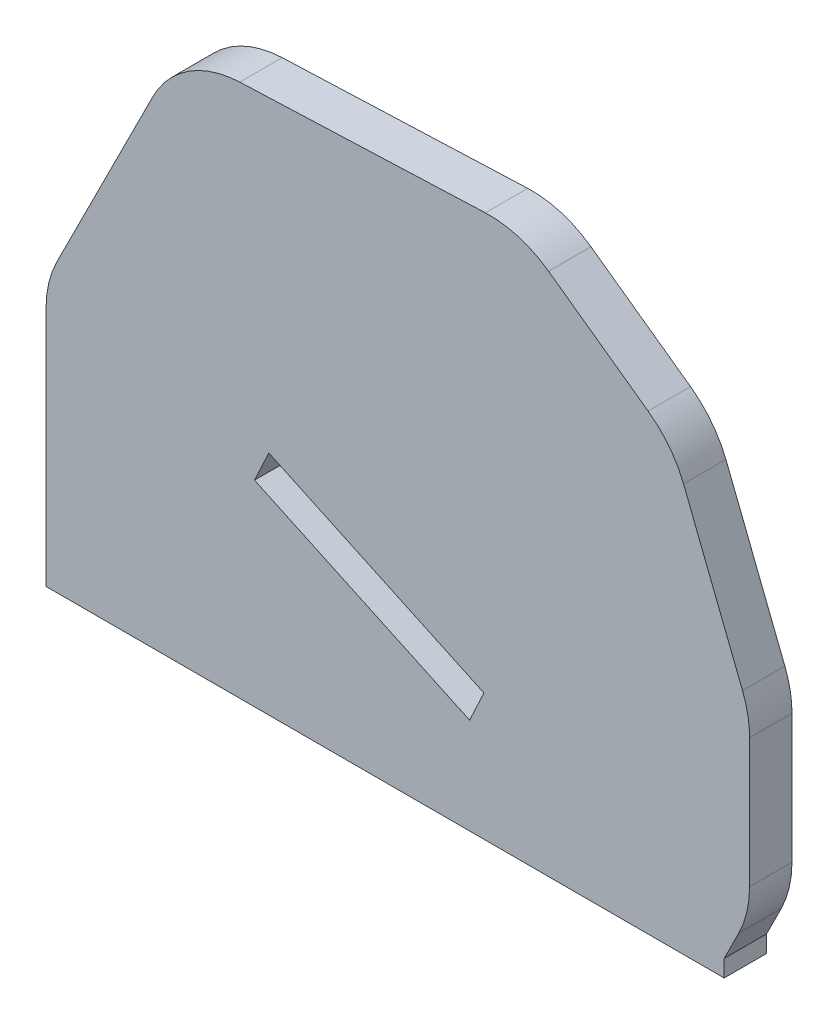
ISO-10303-21;
HEADER;
FILE_DESCRIPTION(('STEP AP214'),'2;1');
FILE_NAME('part.step','',(''),(''),'','','');
FILE_SCHEMA(('AUTOMOTIVE_DESIGN { 1 0 10303 214 1 1 1 1 }'));
ENDSEC;
DATA;
#1=APPLICATION_CONTEXT('core data for automotive mechanical design processes');
#2=APPLICATION_PROTOCOL_DEFINITION('international standard','automotive_design',2000,#1);
#3=PRODUCT_CONTEXT('',#1,'mechanical');
#4=PRODUCT('Part','Part','',(#3));
#5=PRODUCT_RELATED_PRODUCT_CATEGORY('part','',(#4));
#6=PRODUCT_DEFINITION_FORMATION('','',#4);
#7=PRODUCT_DEFINITION_CONTEXT('part definition',#1,'design');
#8=PRODUCT_DEFINITION('design','',#6,#7);
#9=PRODUCT_DEFINITION_SHAPE('','',#8);
#10=(LENGTH_UNIT() NAMED_UNIT(*) SI_UNIT(.MILLI.,.METRE.));
#11=(NAMED_UNIT(*) PLANE_ANGLE_UNIT() SI_UNIT($,.RADIAN.));
#12=(NAMED_UNIT(*) SI_UNIT($,.STERADIAN.) SOLID_ANGLE_UNIT());
#13=UNCERTAINTY_MEASURE_WITH_UNIT(LENGTH_MEASURE(1.E-05),#10,'distance_accuracy_value','');
#14=(GEOMETRIC_REPRESENTATION_CONTEXT(3) GLOBAL_UNCERTAINTY_ASSIGNED_CONTEXT((#13)) GLOBAL_UNIT_ASSIGNED_CONTEXT((#10,
#11,#12)) REPRESENTATION_CONTEXT('',''));
#15=CARTESIAN_POINT('',(0.,0.,0.));
#16=DIRECTION('',(0.,0.,1.));
#17=DIRECTION('',(1.,0.,0.));
#18=AXIS2_PLACEMENT_3D('',#15,#16,#17);
#19=CARTESIAN_POINT('',(0.,0.,0.125));
#20=DIRECTION('',(0.,0.,1.));
#21=DIRECTION('',(1.,0.,0.));
#22=AXIS2_PLACEMENT_3D('',#19,#20,#21);
#23=PLANE('',#22);
#24=DIRECTION('',(0.447213595499958,0.894427190999916,0.));
#25=VECTOR('',#24,1.);
#26=CARTESIAN_POINT('',(4.,0.1,0.125));
#27=LINE('',#26,#25);
#28=CARTESIAN_POINT('',(4.,0.1,0.125));
#29=VERTEX_POINT('',#28);
#30=CARTESIAN_POINT('',(4.08665631459995,0.273312629199899,0.125));
#31=VERTEX_POINT('',#30);
#32=EDGE_CURVE('E215',#29,#31,#27,.T.);
#33=ORIENTED_EDGE('',*,*,#32,.T.);
#34=CARTESIAN_POINT('',(3.55,0.541640786499874,0.125));
#35=DIRECTION('',(0.,0.,1.));
#36=DIRECTION('',(1.,0.,0.));
#37=AXIS2_PLACEMENT_3D('',#34,#35,#36);
#38=CIRCLE('',#37,0.6);
#39=CARTESIAN_POINT('',(4.15,0.541640786499874,0.125));
#40=VERTEX_POINT('',#39);
#41=EDGE_CURVE('E289',#31,#40,#38,.T.);
#42=ORIENTED_EDGE('',*,*,#41,.T.);
#43=DIRECTION('',(0.,1.,0.));
#44=VECTOR('',#43,1.);
#45=CARTESIAN_POINT('',(4.15,0.4,0.125));
#46=LINE('',#45,#44);
#47=CARTESIAN_POINT('',(4.15,1.30201288561444,0.125));
#48=VERTEX_POINT('',#47);
#49=EDGE_CURVE('E218',#40,#48,#46,.T.);
#50=ORIENTED_EDGE('',*,*,#49,.T.);
#51=CARTESIAN_POINT('',(3.55,1.30201288561444,0.125));
#52=DIRECTION('',(0.,0.,1.));
#53=DIRECTION('',(1.,0.,0.));
#54=AXIS2_PLACEMENT_3D('',#51,#52,#53);
#55=CIRCLE('',#54,0.6);
#56=CARTESIAN_POINT('',(4.10813037386705,1.52221843905718,0.125));
#57=VERTEX_POINT('',#56);
#58=EDGE_CURVE('E287',#48,#57,#55,.T.);
#59=ORIENTED_EDGE('',*,*,#58,.T.);
#60=DIRECTION('',(-0.367009255737904,0.930217289778421,0.));
#61=VECTOR('',#60,1.);
#62=CARTESIAN_POINT('',(4.15,1.4160961831835,0.125));
#63=LINE('',#62,#61);
#64=CARTESIAN_POINT('',(3.76013876774564,2.40423382055228,0.125));
#65=VERTEX_POINT('',#64);
#66=EDGE_CURVE('E221',#57,#65,#63,.T.);
#67=ORIENTED_EDGE('',*,*,#66,.T.);
#68=CARTESIAN_POINT('',(3.20200839387859,2.18402826710954,0.125));
#69=DIRECTION('',(0.,0.,1.));
#70=DIRECTION('',(1.,0.,0.));
#71=AXIS2_PLACEMENT_3D('',#68,#69,#70);
#72=CIRCLE('',#71,0.6);
#73=CARTESIAN_POINT('',(3.55147569512048,2.67175011956513,0.125));
#74=VERTEX_POINT('',#73);
#75=EDGE_CURVE('E285',#65,#74,#72,.T.);
#76=ORIENTED_EDGE('',*,*,#75,.T.);
#77=DIRECTION('',(-0.812869754092644,0.582445502069821,0.));
#78=VECTOR('',#77,1.);
#79=CARTESIAN_POINT('',(3.69523272369698,2.5687439069908,0.125));
#80=LINE('',#79,#78);
#81=CARTESIAN_POINT('',(2.96433257743022,3.09245573230092,0.125));
#82=VERTEX_POINT('',#81);
#83=EDGE_CURVE('E224',#74,#82,#80,.T.);
#84=ORIENTED_EDGE('',*,*,#83,.T.);
#85=CARTESIAN_POINT('',(2.61486527618833,2.60473387984534,0.125));
#86=DIRECTION('',(0.,0.,1.));
#87=DIRECTION('',(1.,0.,0.));
#88=AXIS2_PLACEMENT_3D('',#85,#86,#87);
#89=CIRCLE('',#88,0.6);
#90=CARTESIAN_POINT('',(2.59147813086542,3.20427790778127,0.125));
#91=VERTEX_POINT('',#90);
#92=EDGE_CURVE('E283',#82,#91,#89,.T.);
#93=ORIENTED_EDGE('',*,*,#92,.T.);
#94=DIRECTION('',(-0.999240046559891,-0.0389785755381909,0.));
#95=VECTOR('',#94,1.);
#96=CARTESIAN_POINT('',(2.79707885903946,3.2122980262117,0.125));
#97=LINE('',#96,#95);
#98=CARTESIAN_POINT('',(1.14319745318079,3.14778305652908,0.125));
#99=VERTEX_POINT('',#98);
#100=EDGE_CURVE('E227',#91,#99,#97,.T.);
#101=ORIENTED_EDGE('',*,*,#100,.T.);
#102=CARTESIAN_POINT('',(1.16658459850371,2.54823902859315,0.125));
#103=DIRECTION('',(0.,0.,1.));
#104=DIRECTION('',(1.,0.,0.));
#105=AXIS2_PLACEMENT_3D('',#102,#103,#104);
#106=CIRCLE('',#105,0.6);
#107=CARTESIAN_POINT('',(0.630452139512454,2.81761235024173,0.125));
#108=VERTEX_POINT('',#107);
#109=EDGE_CURVE('E55',#99,#108,#106,.T.);
#110=ORIENTED_EDGE('',*,*,#109,.T.);
#111=DIRECTION('',(-0.448955536080968,-0.893554098318759,0.));
#112=VECTOR('',#111,1.);
#113=CARTESIAN_POINT('',(0.789408464148655,3.13398237782225,0.125));
#114=LINE('',#113,#112);
#115=CARTESIAN_POINT('',(0.0638675410087443,1.68994168054322,0.125));
#116=VERTEX_POINT('',#115);
#117=EDGE_CURVE('E229',#108,#116,#114,.T.);
#118=ORIENTED_EDGE('',*,*,#117,.T.);
#119=CARTESIAN_POINT('',(0.6,1.42056835889464,0.125));
#120=DIRECTION('',(0.,0.,1.));
#121=DIRECTION('',(1.,0.,0.));
#122=AXIS2_PLACEMENT_3D('',#119,#120,#121);
#123=CIRCLE('',#122,0.6);
#124=CARTESIAN_POINT('',(0.,1.42056835889464,0.125));
#125=VERTEX_POINT('',#124);
#126=EDGE_CURVE('E280',#116,#125,#123,.T.);
#127=ORIENTED_EDGE('',*,*,#126,.T.);
#128=DIRECTION('',(0.,-1.,0.));
#129=VECTOR('',#128,1.);
#130=CARTESIAN_POINT('',(0.,1.56282641314709,0.125));
#131=LINE('',#130,#129);
#132=CARTESIAN_POINT('',(0.,0.,0.125));
#133=VERTEX_POINT('',#132);
#134=EDGE_CURVE('E208',#125,#133,#131,.T.);
#135=ORIENTED_EDGE('',*,*,#134,.T.);
#136=DIRECTION('',(1.,0.,0.));
#137=VECTOR('',#136,1.);
#138=CARTESIAN_POINT('',(0.,0.,0.125));
#139=LINE('',#138,#137);
#140=CARTESIAN_POINT('',(4.,0.,0.125));
#141=VERTEX_POINT('',#140);
#142=EDGE_CURVE('E210',#133,#141,#139,.T.);
#143=ORIENTED_EDGE('',*,*,#142,.T.);
#144=DIRECTION('',(0.,1.,0.));
#145=VECTOR('',#144,1.);
#146=CARTESIAN_POINT('',(4.,0.,0.125));
#147=LINE('',#146,#145);
#148=EDGE_CURVE('E213',#141,#29,#147,.T.);
#149=ORIENTED_EDGE('',*,*,#148,.T.);
#150=EDGE_LOOP('',(#33,#42,#50,#59,#67,#76,#84,#93,#101,#110,#118,#127,#135,#143,#149));
#151=FACE_BOUND('',#150,.T.);
#152=DIRECTION('',(0.90630778703665,-0.4226182617407,0.));
#153=VECTOR('',#152,1.);
#154=CARTESIAN_POINT('',(1.22976511387802,1.1578168647319,0.125));
#155=LINE('',#154,#153);
#156=CARTESIAN_POINT('',(1.22976511387802,1.1578168647319,0.125));
#157=VERTEX_POINT('',#156);
#158=CARTESIAN_POINT('',(2.49859601572933,0.566151298294916,0.125));
#159=VERTEX_POINT('',#158);
#160=EDGE_CURVE('E177',#157,#159,#155,.T.);
#161=ORIENTED_EDGE('',*,*,#160,.F.);
#162=DIRECTION('',(-0.4226182617407,-0.90630778703665,0.));
#163=VECTOR('',#162,1.);
#164=CARTESIAN_POINT('',(1.22976511387802,1.1578168647319,0.125));
#165=LINE('',#164,#163);
#166=CARTESIAN_POINT('',(1.31428876622616,1.33907842213922,0.125));
#167=VERTEX_POINT('',#166);
#168=EDGE_CURVE('E167',#167,#157,#165,.T.);
#169=ORIENTED_EDGE('',*,*,#168,.F.);
#170=DIRECTION('',(-0.90630778703665,0.422618261740699,0.));
#171=VECTOR('',#170,1.);
#172=CARTESIAN_POINT('',(1.31428876622616,1.33907842213922,0.125));
#173=LINE('',#172,#171);
#174=CARTESIAN_POINT('',(2.58311966807747,0.747412855702245,0.125));
#175=VERTEX_POINT('',#174);
#176=EDGE_CURVE('E192',#175,#167,#173,.T.);
#177=ORIENTED_EDGE('',*,*,#176,.F.);
#178=DIRECTION('',(0.4226182617407,0.90630778703665,0.));
#179=VECTOR('',#178,1.);
#180=CARTESIAN_POINT('',(2.49859601572933,0.566151298294916,0.125));
#181=LINE('',#180,#179);
#182=EDGE_CURVE('E190',#159,#175,#181,.T.);
#183=ORIENTED_EDGE('',*,*,#182,.F.);
#184=EDGE_LOOP('',(#161,#169,#177,#183));
#185=FACE_BOUND('',#184,.T.);
#186=ADVANCED_FACE('F33',(#151,#185),#23,.T.);
#187=CARTESIAN_POINT('',(0.,0.,-0.125));
#188=DIRECTION('',(0.,0.,1.));
#189=DIRECTION('',(1.,0.,0.));
#190=AXIS2_PLACEMENT_3D('',#187,#188,#189);
#191=PLANE('',#190);
#192=DIRECTION('',(0.,1.,0.));
#193=VECTOR('',#192,1.);
#194=CARTESIAN_POINT('',(4.15,0.4,-0.125));
#195=LINE('',#194,#193);
#196=CARTESIAN_POINT('',(4.15,0.541640786499874,-0.125));
#197=VERTEX_POINT('',#196);
#198=CARTESIAN_POINT('',(4.15,1.30201288561444,-0.125));
#199=VERTEX_POINT('',#198);
#200=EDGE_CURVE('E240',#197,#199,#195,.T.);
#201=ORIENTED_EDGE('',*,*,#200,.F.);
#202=CARTESIAN_POINT('',(3.55,0.541640786499874,-0.125));
#203=DIRECTION('',(0.,0.,1.));
#204=DIRECTION('',(1.,0.,0.));
#205=AXIS2_PLACEMENT_3D('',#202,#203,#204);
#206=CIRCLE('',#205,0.6);
#207=CARTESIAN_POINT('',(4.08665631459995,0.273312629199899,-0.125));
#208=VERTEX_POINT('',#207);
#209=EDGE_CURVE('E276',#197,#208,#206,.F.);
#210=ORIENTED_EDGE('',*,*,#209,.T.);
#211=DIRECTION('',(0.447213595499958,0.894427190999916,0.));
#212=VECTOR('',#211,1.);
#213=CARTESIAN_POINT('',(4.,0.1,-0.125));
#214=LINE('',#213,#212);
#215=CARTESIAN_POINT('',(4.,0.1,-0.125));
#216=VERTEX_POINT('',#215);
#217=EDGE_CURVE('E237',#216,#208,#214,.T.);
#218=ORIENTED_EDGE('',*,*,#217,.F.);
#219=DIRECTION('',(0.,1.,0.));
#220=VECTOR('',#219,1.);
#221=CARTESIAN_POINT('',(4.,0.,-0.125));
#222=LINE('',#221,#220);
#223=CARTESIAN_POINT('',(4.,0.,-0.125));
#224=VERTEX_POINT('',#223);
#225=EDGE_CURVE('E235',#224,#216,#222,.T.);
#226=ORIENTED_EDGE('',*,*,#225,.F.);
#227=DIRECTION('',(1.,0.,0.));
#228=VECTOR('',#227,1.);
#229=CARTESIAN_POINT('',(0.,0.,-0.125));
#230=LINE('',#229,#228);
#231=CARTESIAN_POINT('',(0.,0.,-0.125));
#232=VERTEX_POINT('',#231);
#233=EDGE_CURVE('E233',#232,#224,#230,.T.);
#234=ORIENTED_EDGE('',*,*,#233,.F.);
#235=DIRECTION('',(0.,-1.,0.));
#236=VECTOR('',#235,1.);
#237=CARTESIAN_POINT('',(0.,1.56282641314709,-0.125));
#238=LINE('',#237,#236);
#239=CARTESIAN_POINT('',(0.,1.42056835889464,-0.125));
#240=VERTEX_POINT('',#239);
#241=EDGE_CURVE('E185',#240,#232,#238,.T.);
#242=ORIENTED_EDGE('',*,*,#241,.F.);
#243=CARTESIAN_POINT('',(0.6,1.42056835889464,-0.125));
#244=DIRECTION('',(0.,0.,1.));
#245=DIRECTION('',(1.,0.,0.));
#246=AXIS2_PLACEMENT_3D('',#243,#244,#245);
#247=CIRCLE('',#246,0.6);
#248=CARTESIAN_POINT('',(0.0638675410087443,1.68994168054322,-0.125));
#249=VERTEX_POINT('',#248);
#250=EDGE_CURVE('E266',#240,#249,#247,.F.);
#251=ORIENTED_EDGE('',*,*,#250,.T.);
#252=DIRECTION('',(-0.448955536080968,-0.893554098318759,0.));
#253=VECTOR('',#252,1.);
#254=CARTESIAN_POINT('',(0.789408464148655,3.13398237782225,-0.125));
#255=LINE('',#254,#253);
#256=CARTESIAN_POINT('',(0.630452139512454,2.81761235024173,-0.125));
#257=VERTEX_POINT('',#256);
#258=EDGE_CURVE('E211',#257,#249,#255,.T.);
#259=ORIENTED_EDGE('',*,*,#258,.F.);
#260=CARTESIAN_POINT('',(1.16658459850371,2.54823902859315,-0.125));
#261=DIRECTION('',(0.,0.,1.));
#262=DIRECTION('',(1.,0.,0.));
#263=AXIS2_PLACEMENT_3D('',#260,#261,#262);
#264=CIRCLE('',#263,0.6);
#265=CARTESIAN_POINT('',(1.14319745318079,3.14778305652908,-0.125));
#266=VERTEX_POINT('',#265);
#267=EDGE_CURVE('E268',#257,#266,#264,.F.);
#268=ORIENTED_EDGE('',*,*,#267,.T.);
#269=DIRECTION('',(-0.999240046559891,-0.0389785755381909,0.));
#270=VECTOR('',#269,1.);
#271=CARTESIAN_POINT('',(2.79707885903946,3.2122980262117,-0.125));
#272=LINE('',#271,#270);
#273=CARTESIAN_POINT('',(2.59147813086542,3.20427790778127,-0.125));
#274=VERTEX_POINT('',#273);
#275=EDGE_CURVE('E249',#274,#266,#272,.T.);
#276=ORIENTED_EDGE('',*,*,#275,.F.);
#277=CARTESIAN_POINT('',(2.61486527618833,2.60473387984534,-0.125));
#278=DIRECTION('',(0.,0.,1.));
#279=DIRECTION('',(1.,0.,0.));
#280=AXIS2_PLACEMENT_3D('',#277,#278,#279);
#281=CIRCLE('',#280,0.6);
#282=CARTESIAN_POINT('',(2.96433257743022,3.09245573230092,-0.125));
#283=VERTEX_POINT('',#282);
#284=EDGE_CURVE('E270',#274,#283,#281,.F.);
#285=ORIENTED_EDGE('',*,*,#284,.T.);
#286=DIRECTION('',(-0.812869754092644,0.582445502069821,0.));
#287=VECTOR('',#286,1.);
#288=CARTESIAN_POINT('',(3.69523272369698,2.5687439069908,-0.125));
#289=LINE('',#288,#287);
#290=CARTESIAN_POINT('',(3.55147569512048,2.67175011956513,-0.125));
#291=VERTEX_POINT('',#290);
#292=EDGE_CURVE('E246',#291,#283,#289,.T.);
#293=ORIENTED_EDGE('',*,*,#292,.F.);
#294=CARTESIAN_POINT('',(3.20200839387859,2.18402826710954,-0.125));
#295=DIRECTION('',(0.,0.,1.));
#296=DIRECTION('',(1.,0.,0.));
#297=AXIS2_PLACEMENT_3D('',#294,#295,#296);
#298=CIRCLE('',#297,0.6);
#299=CARTESIAN_POINT('',(3.76013876774564,2.40423382055228,-0.125));
#300=VERTEX_POINT('',#299);
#301=EDGE_CURVE('E272',#291,#300,#298,.F.);
#302=ORIENTED_EDGE('',*,*,#301,.T.);
#303=DIRECTION('',(-0.367009255737904,0.930217289778421,0.));
#304=VECTOR('',#303,1.);
#305=CARTESIAN_POINT('',(4.15,1.4160961831835,-0.125));
#306=LINE('',#305,#304);
#307=CARTESIAN_POINT('',(4.10813037386705,1.52221843905718,-0.125));
#308=VERTEX_POINT('',#307);
#309=EDGE_CURVE('E243',#308,#300,#306,.T.);
#310=ORIENTED_EDGE('',*,*,#309,.F.);
#311=CARTESIAN_POINT('',(3.55,1.30201288561444,-0.125));
#312=DIRECTION('',(0.,0.,1.));
#313=DIRECTION('',(1.,0.,0.));
#314=AXIS2_PLACEMENT_3D('',#311,#312,#313);
#315=CIRCLE('',#314,0.6);
#316=EDGE_CURVE('E274',#308,#199,#315,.F.);
#317=ORIENTED_EDGE('',*,*,#316,.T.);
#318=EDGE_LOOP('',(#201,#210,#218,#226,#234,#242,#251,#259,#268,#276,#285,#293,#302,#310,#317));
#319=FACE_BOUND('',#318,.T.);
#320=DIRECTION('',(-0.4226182617407,-0.90630778703665,0.));
#321=VECTOR('',#320,1.);
#322=CARTESIAN_POINT('',(1.22976511387802,1.1578168647319,-0.125));
#323=LINE('',#322,#321);
#324=CARTESIAN_POINT('',(1.31428876622616,1.33907842213922,-0.125));
#325=VERTEX_POINT('',#324);
#326=CARTESIAN_POINT('',(1.22976511387802,1.1578168647319,-0.125));
#327=VERTEX_POINT('',#326);
#328=EDGE_CURVE('E196',#325,#327,#323,.T.);
#329=ORIENTED_EDGE('',*,*,#328,.T.);
#330=DIRECTION('',(0.90630778703665,-0.4226182617407,0.));
#331=VECTOR('',#330,1.);
#332=CARTESIAN_POINT('',(1.22976511387802,1.1578168647319,-0.125));
#333=LINE('',#332,#331);
#334=CARTESIAN_POINT('',(2.49859601572933,0.566151298294916,-0.125));
#335=VERTEX_POINT('',#334);
#336=EDGE_CURVE('E184',#327,#335,#333,.T.);
#337=ORIENTED_EDGE('',*,*,#336,.T.);
#338=DIRECTION('',(0.4226182617407,0.90630778703665,0.));
#339=VECTOR('',#338,1.);
#340=CARTESIAN_POINT('',(2.49859601572933,0.566151298294916,-0.125));
#341=LINE('',#340,#339);
#342=CARTESIAN_POINT('',(2.58311966807747,0.747412855702245,-0.125));
#343=VERTEX_POINT('',#342);
#344=EDGE_CURVE('E199',#335,#343,#341,.T.);
#345=ORIENTED_EDGE('',*,*,#344,.T.);
#346=DIRECTION('',(-0.90630778703665,0.422618261740699,0.));
#347=VECTOR('',#346,1.);
#348=CARTESIAN_POINT('',(1.31428876622616,1.33907842213922,-0.125));
#349=LINE('',#348,#347);
#350=EDGE_CURVE('E178',#343,#325,#349,.T.);
#351=ORIENTED_EDGE('',*,*,#350,.T.);
#352=EDGE_LOOP('',(#329,#337,#345,#351));
#353=FACE_BOUND('',#352,.T.);
#354=ADVANCED_FACE('F313',(#319,#353),#191,.F.);
#355=CARTESIAN_POINT('',(0.,1.56282641314709,0.125));
#356=DIRECTION('',(1.,0.,0.));
#357=DIRECTION('',(0.,1.,0.));
#358=AXIS2_PLACEMENT_3D('',#355,#356,#357);
#359=PLANE('',#358);
#360=ORIENTED_EDGE('',*,*,#134,.F.);
#361=DIRECTION('',(0.,0.,-1.));
#362=VECTOR('',#361,1.);
#363=CARTESIAN_POINT('',(0.,1.42056835889464,0.125));
#364=LINE('',#363,#362);
#365=EDGE_CURVE('E11',#125,#240,#364,.T.);
#366=ORIENTED_EDGE('',*,*,#365,.T.);
#367=ORIENTED_EDGE('',*,*,#241,.T.);
#368=DIRECTION('',(0.,0.,-1.));
#369=VECTOR('',#368,1.);
#370=CARTESIAN_POINT('',(0.,0.,0.125));
#371=LINE('',#370,#369);
#372=EDGE_CURVE('E258',#133,#232,#371,.T.);
#373=ORIENTED_EDGE('',*,*,#372,.F.);
#374=EDGE_LOOP('',(#360,#366,#367,#373));
#375=FACE_BOUND('',#374,.T.);
#376=ADVANCED_FACE('F323',(#375),#359,.F.);
#377=CARTESIAN_POINT('',(0.,0.,0.125));
#378=DIRECTION('',(0.,1.,0.));
#379=DIRECTION('',(0.,0.,1.));
#380=AXIS2_PLACEMENT_3D('',#377,#378,#379);
#381=PLANE('',#380);
#382=ORIENTED_EDGE('',*,*,#233,.T.);
#383=DIRECTION('',(0.,0.,-1.));
#384=VECTOR('',#383,1.);
#385=CARTESIAN_POINT('',(4.,0.,0.125));
#386=LINE('',#385,#384);
#387=EDGE_CURVE('E255',#141,#224,#386,.T.);
#388=ORIENTED_EDGE('',*,*,#387,.F.);
#389=ORIENTED_EDGE('',*,*,#142,.F.);
#390=ORIENTED_EDGE('',*,*,#372,.T.);
#391=EDGE_LOOP('',(#382,#388,#389,#390));
#392=FACE_BOUND('',#391,.T.);
#393=ADVANCED_FACE('F328',(#392),#381,.F.);
#394=CARTESIAN_POINT('',(4.,0.,0.125));
#395=DIRECTION('',(-1.,0.,0.));
#396=DIRECTION('',(0.,0.,1.));
#397=AXIS2_PLACEMENT_3D('',#394,#395,#396);
#398=PLANE('',#397);
#399=ORIENTED_EDGE('',*,*,#225,.T.);
#400=DIRECTION('',(0.,0.,-1.));
#401=VECTOR('',#400,1.);
#402=CARTESIAN_POINT('',(4.,0.1,0.125));
#403=LINE('',#402,#401);
#404=EDGE_CURVE('E231',#29,#216,#403,.T.);
#405=ORIENTED_EDGE('',*,*,#404,.F.);
#406=ORIENTED_EDGE('',*,*,#148,.F.);
#407=ORIENTED_EDGE('',*,*,#387,.T.);
#408=EDGE_LOOP('',(#399,#405,#406,#407));
#409=FACE_BOUND('',#408,.T.);
#410=ADVANCED_FACE('F333',(#409),#398,.F.);
#411=CARTESIAN_POINT('',(4.,0.1,0.125));
#412=DIRECTION('',(-0.894427190999916,0.447213595499958,0.));
#413=DIRECTION('',(-0.447213595499958,-0.894427190999916,0.));
#414=AXIS2_PLACEMENT_3D('',#411,#412,#413);
#415=PLANE('',#414);
#416=ORIENTED_EDGE('',*,*,#217,.T.);
#417=DIRECTION('',(0.,0.,-1.));
#418=VECTOR('',#417,1.);
#419=CARTESIAN_POINT('',(4.08665631459995,0.273312629199899,0.125));
#420=LINE('',#419,#418);
#421=EDGE_CURVE('E278',#208,#31,#420,.F.);
#422=ORIENTED_EDGE('',*,*,#421,.T.);
#423=ORIENTED_EDGE('',*,*,#32,.F.);
#424=ORIENTED_EDGE('',*,*,#404,.T.);
#425=EDGE_LOOP('',(#416,#422,#423,#424));
#426=FACE_BOUND('',#425,.T.);
#427=ADVANCED_FACE('F398',(#426),#415,.F.);
#428=CARTESIAN_POINT('',(4.15,0.4,0.125));
#429=DIRECTION('',(-1.,0.,0.));
#430=DIRECTION('',(0.,0.,1.));
#431=AXIS2_PLACEMENT_3D('',#428,#429,#430);
#432=PLANE('',#431);
#433=ORIENTED_EDGE('',*,*,#49,.F.);
#434=DIRECTION('',(0.,0.,-1.));
#435=VECTOR('',#434,1.);
#436=CARTESIAN_POINT('',(4.15,0.541640786499874,0.125));
#437=LINE('',#436,#435);
#438=EDGE_CURVE('E263',#40,#197,#437,.T.);
#439=ORIENTED_EDGE('',*,*,#438,.T.);
#440=ORIENTED_EDGE('',*,*,#200,.T.);
#441=DIRECTION('',(0.,0.,-1.));
#442=VECTOR('',#441,1.);
#443=CARTESIAN_POINT('',(4.15,1.30201288561444,0.125));
#444=LINE('',#443,#442);
#445=EDGE_CURVE('E261',#199,#48,#444,.F.);
#446=ORIENTED_EDGE('',*,*,#445,.T.);
#447=EDGE_LOOP('',(#433,#439,#440,#446));
#448=FACE_BOUND('',#447,.T.);
#449=ADVANCED_FACE('F343',(#448),#432,.F.);
#450=CARTESIAN_POINT('',(4.15,1.4160961831835,0.125));
#451=DIRECTION('',(-0.930217289778421,-0.367009255737904,0.));
#452=DIRECTION('',(0.367009255737904,-0.930217289778421,0.));
#453=AXIS2_PLACEMENT_3D('',#450,#451,#452);
#454=PLANE('',#453);
#455=ORIENTED_EDGE('',*,*,#66,.F.);
#456=DIRECTION('',(0.,0.,-1.));
#457=VECTOR('',#456,1.);
#458=CARTESIAN_POINT('',(4.10813037386705,1.52221843905718,0.125));
#459=LINE('',#458,#457);
#460=EDGE_CURVE('E293',#57,#308,#459,.T.);
#461=ORIENTED_EDGE('',*,*,#460,.T.);
#462=ORIENTED_EDGE('',*,*,#309,.T.);
#463=DIRECTION('',(0.,0.,-1.));
#464=VECTOR('',#463,1.);
#465=CARTESIAN_POINT('',(3.76013876774564,2.40423382055228,0.125));
#466=LINE('',#465,#464);
#467=EDGE_CURVE('E291',#300,#65,#466,.F.);
#468=ORIENTED_EDGE('',*,*,#467,.T.);
#469=EDGE_LOOP('',(#455,#461,#462,#468));
#470=FACE_BOUND('',#469,.T.);
#471=ADVANCED_FACE('F353',(#470),#454,.F.);
#472=CARTESIAN_POINT('',(3.69523272369698,2.5687439069908,0.125));
#473=DIRECTION('',(-0.582445502069821,-0.812869754092643,0.));
#474=DIRECTION('',(0.812869754092644,-0.582445502069821,0.));
#475=AXIS2_PLACEMENT_3D('',#472,#473,#474);
#476=PLANE('',#475);
#477=ORIENTED_EDGE('',*,*,#83,.F.);
#478=DIRECTION('',(0.,0.,-1.));
#479=VECTOR('',#478,1.);
#480=CARTESIAN_POINT('',(3.55147569512048,2.67175011956513,0.125));
#481=LINE('',#480,#479);
#482=EDGE_CURVE('E298',#74,#291,#481,.T.);
#483=ORIENTED_EDGE('',*,*,#482,.T.);
#484=ORIENTED_EDGE('',*,*,#292,.T.);
#485=DIRECTION('',(0.,0.,-1.));
#486=VECTOR('',#485,1.);
#487=CARTESIAN_POINT('',(2.96433257743022,3.09245573230092,0.125));
#488=LINE('',#487,#486);
#489=EDGE_CURVE('E296',#283,#82,#488,.F.);
#490=ORIENTED_EDGE('',*,*,#489,.T.);
#491=EDGE_LOOP('',(#477,#483,#484,#490));
#492=FACE_BOUND('',#491,.T.);
#493=ADVANCED_FACE('F362',(#492),#476,.F.);
#494=CARTESIAN_POINT('',(2.79707885903946,3.2122980262117,0.125));
#495=DIRECTION('',(0.0389785755381909,-0.999240046559891,0.));
#496=DIRECTION('',(0.999240046559891,0.0389785755381909,0.));
#497=AXIS2_PLACEMENT_3D('',#494,#495,#496);
#498=PLANE('',#497);
#499=ORIENTED_EDGE('',*,*,#100,.F.);
#500=DIRECTION('',(0.,0.,-1.));
#501=VECTOR('',#500,1.);
#502=CARTESIAN_POINT('',(2.59147813086542,3.20427790778127,0.125));
#503=LINE('',#502,#501);
#504=EDGE_CURVE('E303',#91,#274,#503,.T.);
#505=ORIENTED_EDGE('',*,*,#504,.T.);
#506=ORIENTED_EDGE('',*,*,#275,.T.);
#507=DIRECTION('',(0.,0.,-1.));
#508=VECTOR('',#507,1.);
#509=CARTESIAN_POINT('',(1.14319745318079,3.14778305652908,0.125));
#510=LINE('',#509,#508);
#511=EDGE_CURVE('E301',#266,#99,#510,.F.);
#512=ORIENTED_EDGE('',*,*,#511,.T.);
#513=EDGE_LOOP('',(#499,#505,#506,#512));
#514=FACE_BOUND('',#513,.T.);
#515=ADVANCED_FACE('F370',(#514),#498,.F.);
#516=CARTESIAN_POINT('',(0.789408464148655,3.13398237782225,0.125));
#517=DIRECTION('',(0.893554098318759,-0.448955536080968,0.));
#518=DIRECTION('',(0.448955536080968,0.893554098318759,0.));
#519=AXIS2_PLACEMENT_3D('',#516,#517,#518);
#520=PLANE('',#519);
#521=ORIENTED_EDGE('',*,*,#117,.F.);
#522=DIRECTION('',(0.,0.,-1.));
#523=VECTOR('',#522,1.);
#524=CARTESIAN_POINT('',(0.630452139512454,2.81761235024173,0.125));
#525=LINE('',#524,#523);
#526=EDGE_CURVE('E41',#108,#257,#525,.T.);
#527=ORIENTED_EDGE('',*,*,#526,.T.);
#528=ORIENTED_EDGE('',*,*,#258,.T.);
#529=DIRECTION('',(0.,0.,-1.));
#530=VECTOR('',#529,1.);
#531=CARTESIAN_POINT('',(0.0638675410087443,1.68994168054322,0.125));
#532=LINE('',#531,#530);
#533=EDGE_CURVE('E48',#249,#116,#532,.F.);
#534=ORIENTED_EDGE('',*,*,#533,.T.);
#535=EDGE_LOOP('',(#521,#527,#528,#534));
#536=FACE_BOUND('',#535,.T.);
#537=ADVANCED_FACE('F309',(#536),#520,.F.);
#538=CARTESIAN_POINT('',(1.22976511387802,1.1578168647319,0.125));
#539=DIRECTION('',(0.90630778703665,-0.4226182617407,0.));
#540=DIRECTION('',(0.4226182617407,0.90630778703665,0.));
#541=AXIS2_PLACEMENT_3D('',#538,#539,#540);
#542=PLANE('',#541);
#543=ORIENTED_EDGE('',*,*,#328,.F.);
#544=DIRECTION('',(0.,0.,-1.));
#545=VECTOR('',#544,1.);
#546=CARTESIAN_POINT('',(1.31428876622616,1.33907842213922,0.125));
#547=LINE('',#546,#545);
#548=EDGE_CURVE('E173',#167,#325,#547,.T.);
#549=ORIENTED_EDGE('',*,*,#548,.F.);
#550=ORIENTED_EDGE('',*,*,#168,.T.);
#551=DIRECTION('',(0.,0.,-1.));
#552=VECTOR('',#551,1.);
#553=CARTESIAN_POINT('',(1.22976511387802,1.1578168647319,0.125));
#554=LINE('',#553,#552);
#555=EDGE_CURVE('E170',#157,#327,#554,.T.);
#556=ORIENTED_EDGE('',*,*,#555,.T.);
#557=EDGE_LOOP('',(#543,#549,#550,#556));
#558=FACE_BOUND('',#557,.T.);
#559=ADVANCED_FACE('F169',(#558),#542,.T.);
#560=CARTESIAN_POINT('',(1.22976511387802,1.1578168647319,0.125));
#561=DIRECTION('',(0.4226182617407,0.90630778703665,0.));
#562=DIRECTION('',(-0.90630778703665,0.4226182617407,0.));
#563=AXIS2_PLACEMENT_3D('',#560,#561,#562);
#564=PLANE('',#563);
#565=ORIENTED_EDGE('',*,*,#336,.F.);
#566=ORIENTED_EDGE('',*,*,#555,.F.);
#567=ORIENTED_EDGE('',*,*,#160,.T.);
#568=DIRECTION('',(0.,0.,-1.));
#569=VECTOR('',#568,1.);
#570=CARTESIAN_POINT('',(2.49859601572933,0.566151298294916,0.125));
#571=LINE('',#570,#569);
#572=EDGE_CURVE('E186',#159,#335,#571,.T.);
#573=ORIENTED_EDGE('',*,*,#572,.T.);
#574=EDGE_LOOP('',(#565,#566,#567,#573));
#575=FACE_BOUND('',#574,.T.);
#576=ADVANCED_FACE('F181',(#575),#564,.T.);
#577=CARTESIAN_POINT('',(2.49859601572933,0.566151298294916,0.125));
#578=DIRECTION('',(-0.90630778703665,0.4226182617407,0.));
#579=DIRECTION('',(-0.4226182617407,-0.90630778703665,0.));
#580=AXIS2_PLACEMENT_3D('',#577,#578,#579);
#581=PLANE('',#580);
#582=ORIENTED_EDGE('',*,*,#344,.F.);
#583=ORIENTED_EDGE('',*,*,#572,.F.);
#584=ORIENTED_EDGE('',*,*,#182,.T.);
#585=DIRECTION('',(0.,0.,-1.));
#586=VECTOR('',#585,1.);
#587=CARTESIAN_POINT('',(2.58311966807747,0.747412855702245,0.125));
#588=LINE('',#587,#586);
#589=EDGE_CURVE('E205',#175,#343,#588,.T.);
#590=ORIENTED_EDGE('',*,*,#589,.T.);
#591=EDGE_LOOP('',(#582,#583,#584,#590));
#592=FACE_BOUND('',#591,.T.);
#593=ADVANCED_FACE('F453',(#592),#581,.T.);
#594=CARTESIAN_POINT('',(1.31428876622616,1.33907842213922,0.125));
#595=DIRECTION('',(-0.422618261740699,-0.90630778703665,0.));
#596=DIRECTION('',(0.90630778703665,-0.422618261740699,0.));
#597=AXIS2_PLACEMENT_3D('',#594,#595,#596);
#598=PLANE('',#597);
#599=ORIENTED_EDGE('',*,*,#350,.F.);
#600=ORIENTED_EDGE('',*,*,#589,.F.);
#601=ORIENTED_EDGE('',*,*,#176,.T.);
#602=ORIENTED_EDGE('',*,*,#548,.T.);
#603=EDGE_LOOP('',(#599,#600,#601,#602));
#604=FACE_BOUND('',#603,.T.);
#605=ADVANCED_FACE('F409',(#604),#598,.T.);
#606=CARTESIAN_POINT('',(3.55,0.541640786499874,0.125));
#607=DIRECTION('',(0.,0.,-1.));
#608=DIRECTION('',(-1.,0.,0.));
#609=AXIS2_PLACEMENT_3D('',#606,#607,#608);
#610=CYLINDRICAL_SURFACE('',#609,0.6);
#611=ORIENTED_EDGE('',*,*,#41,.F.);
#612=ORIENTED_EDGE('',*,*,#421,.F.);
#613=ORIENTED_EDGE('',*,*,#209,.F.);
#614=ORIENTED_EDGE('',*,*,#438,.F.);
#615=EDGE_LOOP('',(#611,#612,#613,#614));
#616=FACE_BOUND('',#615,.T.);
#617=ADVANCED_FACE('F341',(#616),#610,.T.);
#618=CARTESIAN_POINT('',(3.55,1.30201288561444,0.125));
#619=DIRECTION('',(0.,0.,-1.));
#620=DIRECTION('',(-1.,0.,0.));
#621=AXIS2_PLACEMENT_3D('',#618,#619,#620);
#622=CYLINDRICAL_SURFACE('',#621,0.6);
#623=ORIENTED_EDGE('',*,*,#58,.F.);
#624=ORIENTED_EDGE('',*,*,#445,.F.);
#625=ORIENTED_EDGE('',*,*,#316,.F.);
#626=ORIENTED_EDGE('',*,*,#460,.F.);
#627=EDGE_LOOP('',(#623,#624,#625,#626));
#628=FACE_BOUND('',#627,.T.);
#629=ADVANCED_FACE('F350',(#628),#622,.T.);
#630=CARTESIAN_POINT('',(3.20200839387859,2.18402826710954,0.125));
#631=DIRECTION('',(0.,0.,-1.));
#632=DIRECTION('',(-1.,0.,0.));
#633=AXIS2_PLACEMENT_3D('',#630,#631,#632);
#634=CYLINDRICAL_SURFACE('',#633,0.6);
#635=ORIENTED_EDGE('',*,*,#75,.F.);
#636=ORIENTED_EDGE('',*,*,#467,.F.);
#637=ORIENTED_EDGE('',*,*,#301,.F.);
#638=ORIENTED_EDGE('',*,*,#482,.F.);
#639=EDGE_LOOP('',(#635,#636,#637,#638));
#640=FACE_BOUND('',#639,.T.);
#641=ADVANCED_FACE('F359',(#640),#634,.T.);
#642=CARTESIAN_POINT('',(2.61486527618833,2.60473387984534,0.125));
#643=DIRECTION('',(0.,0.,-1.));
#644=DIRECTION('',(-1.,0.,0.));
#645=AXIS2_PLACEMENT_3D('',#642,#643,#644);
#646=CYLINDRICAL_SURFACE('',#645,0.6);
#647=ORIENTED_EDGE('',*,*,#92,.F.);
#648=ORIENTED_EDGE('',*,*,#489,.F.);
#649=ORIENTED_EDGE('',*,*,#284,.F.);
#650=ORIENTED_EDGE('',*,*,#504,.F.);
#651=EDGE_LOOP('',(#647,#648,#649,#650));
#652=FACE_BOUND('',#651,.T.);
#653=ADVANCED_FACE('F367',(#652),#646,.T.);
#654=CARTESIAN_POINT('',(1.16658459850371,2.54823902859315,0.125));
#655=DIRECTION('',(0.,0.,-1.));
#656=DIRECTION('',(-1.,0.,0.));
#657=AXIS2_PLACEMENT_3D('',#654,#655,#656);
#658=CYLINDRICAL_SURFACE('',#657,0.6);
#659=ORIENTED_EDGE('',*,*,#109,.F.);
#660=ORIENTED_EDGE('',*,*,#511,.F.);
#661=ORIENTED_EDGE('',*,*,#267,.F.);
#662=ORIENTED_EDGE('',*,*,#526,.F.);
#663=EDGE_LOOP('',(#659,#660,#661,#662));
#664=FACE_BOUND('',#663,.T.);
#665=ADVANCED_FACE('F372',(#664),#658,.T.);
#666=CARTESIAN_POINT('',(0.6,1.42056835889464,0.125));
#667=DIRECTION('',(0.,0.,-1.));
#668=DIRECTION('',(-1.,0.,0.));
#669=AXIS2_PLACEMENT_3D('',#666,#667,#668);
#670=CYLINDRICAL_SURFACE('',#669,0.6);
#671=ORIENTED_EDGE('',*,*,#126,.F.);
#672=ORIENTED_EDGE('',*,*,#533,.F.);
#673=ORIENTED_EDGE('',*,*,#250,.F.);
#674=ORIENTED_EDGE('',*,*,#365,.F.);
#675=EDGE_LOOP('',(#671,#672,#673,#674));
#676=FACE_BOUND('',#675,.T.);
#677=ADVANCED_FACE('F35',(#676),#670,.T.);
#678=CLOSED_SHELL('',(#186,#354,#376,#393,#410,#427,#449,#471,#493,#515,#537,#559,#576,#593,
#605,#617,#629,#641,#653,#665,#677));
#679=MANIFOLD_SOLID_BREP('B2',#678);
#680=ADVANCED_BREP_SHAPE_REPRESENTATION('',(#18,#679),#14);
#681=SHAPE_DEFINITION_REPRESENTATION(#9,#680);
ENDSEC;
END-ISO-10303-21;
